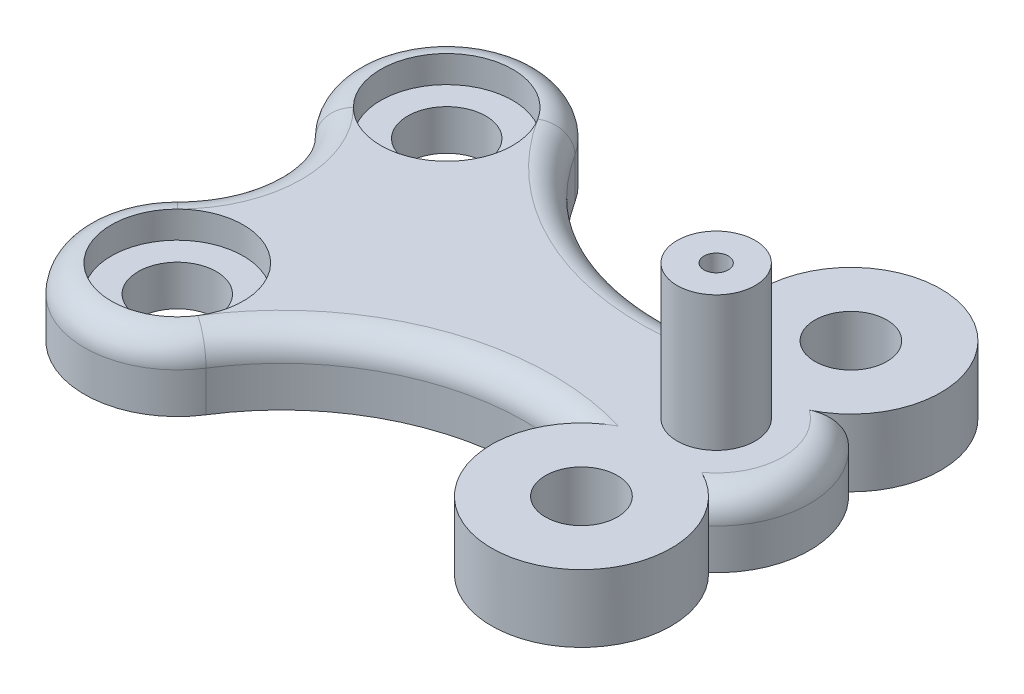
ISO-10303-21;
HEADER;
FILE_DESCRIPTION(('STEP AP214'),'2;1');
FILE_NAME('part.step','',(''),(''),'','','');
FILE_SCHEMA(('AUTOMOTIVE_DESIGN { 1 0 10303 214 1 1 1 1 }'));
ENDSEC;
DATA;
#1=APPLICATION_CONTEXT('core data for automotive mechanical design processes');
#2=APPLICATION_PROTOCOL_DEFINITION('international standard','automotive_design',2000,#1);
#3=PRODUCT_CONTEXT('',#1,'mechanical');
#4=PRODUCT('Part','Part','',(#3));
#5=PRODUCT_RELATED_PRODUCT_CATEGORY('part','',(#4));
#6=PRODUCT_DEFINITION_FORMATION('','',#4);
#7=PRODUCT_DEFINITION_CONTEXT('part definition',#1,'design');
#8=PRODUCT_DEFINITION('design','',#6,#7);
#9=PRODUCT_DEFINITION_SHAPE('','',#8);
#10=(LENGTH_UNIT() NAMED_UNIT(*) SI_UNIT(.MILLI.,.METRE.));
#11=(NAMED_UNIT(*) PLANE_ANGLE_UNIT() SI_UNIT($,.RADIAN.));
#12=(NAMED_UNIT(*) SI_UNIT($,.STERADIAN.) SOLID_ANGLE_UNIT());
#13=UNCERTAINTY_MEASURE_WITH_UNIT(LENGTH_MEASURE(1.E-05),#10,'distance_accuracy_value','');
#14=(GEOMETRIC_REPRESENTATION_CONTEXT(3) GLOBAL_UNCERTAINTY_ASSIGNED_CONTEXT((#13)) GLOBAL_UNIT_ASSIGNED_CONTEXT((#10,
#11,#12)) REPRESENTATION_CONTEXT('',''));
#15=CARTESIAN_POINT('',(0.,0.,0.));
#16=DIRECTION('',(0.,0.,1.));
#17=DIRECTION('',(1.,0.,0.));
#18=AXIS2_PLACEMENT_3D('',#15,#16,#17);
#19=CARTESIAN_POINT('',(0.,2.5,-5.));
#20=DIRECTION('',(0.,-1.,0.));
#21=DIRECTION('',(0.,0.,-1.));
#22=AXIS2_PLACEMENT_3D('',#19,#20,#21);
#23=CYLINDRICAL_SURFACE('',#22,1.45);
#24=CARTESIAN_POINT('',(0.,0.,-5.));
#25=DIRECTION('',(0.,1.,0.));
#26=DIRECTION('',(0.,0.,1.));
#27=AXIS2_PLACEMENT_3D('',#24,#25,#26);
#28=CIRCLE('',#27,1.45);
#29=CARTESIAN_POINT('',(0.,0.,-3.55));
#30=VERTEX_POINT('',#29);
#31=EDGE_CURVE('E156',#30,#30,#28,.T.);
#32=ORIENTED_EDGE('',*,*,#31,.F.);
#33=EDGE_LOOP('',(#32));
#34=FACE_BOUND('',#33,.T.);
#35=CARTESIAN_POINT('',(0.,1.5,-5.));
#36=DIRECTION('',(0.,1.,0.));
#37=DIRECTION('',(0.,0.,1.));
#38=AXIS2_PLACEMENT_3D('',#35,#36,#37);
#39=CIRCLE('',#38,1.45);
#40=CARTESIAN_POINT('',(0.,1.5,-3.55));
#41=VERTEX_POINT('',#40);
#42=EDGE_CURVE('E196',#41,#41,#39,.T.);
#43=ORIENTED_EDGE('',*,*,#42,.T.);
#44=EDGE_LOOP('',(#43));
#45=FACE_BOUND('',#44,.T.);
#46=ADVANCED_FACE('F39',(#34,#45),#23,.F.);
#47=CARTESIAN_POINT('',(0.,2.5,5.));
#48=DIRECTION('',(0.,-1.,0.));
#49=DIRECTION('',(0.,0.,-1.));
#50=AXIS2_PLACEMENT_3D('',#47,#48,#49);
#51=CYLINDRICAL_SURFACE('',#50,1.45);
#52=CARTESIAN_POINT('',(0.,0.,5.));
#53=DIRECTION('',(0.,1.,0.));
#54=DIRECTION('',(0.,0.,-1.));
#55=AXIS2_PLACEMENT_3D('',#52,#53,#54);
#56=CIRCLE('',#55,1.45);
#57=CARTESIAN_POINT('',(0.,0.,3.55));
#58=VERTEX_POINT('',#57);
#59=EDGE_CURVE('E159',#58,#58,#56,.T.);
#60=ORIENTED_EDGE('',*,*,#59,.F.);
#61=EDGE_LOOP('',(#60));
#62=FACE_BOUND('',#61,.T.);
#63=CARTESIAN_POINT('',(0.,1.5,5.));
#64=DIRECTION('',(0.,1.,0.));
#65=DIRECTION('',(0.,0.,1.));
#66=AXIS2_PLACEMENT_3D('',#63,#64,#65);
#67=CIRCLE('',#66,1.45);
#68=CARTESIAN_POINT('',(0.,1.5,6.45));
#69=VERTEX_POINT('',#68);
#70=EDGE_CURVE('E193',#69,#69,#67,.T.);
#71=ORIENTED_EDGE('',*,*,#70,.T.);
#72=EDGE_LOOP('',(#71));
#73=FACE_BOUND('',#72,.T.);
#74=ADVANCED_FACE('F273',(#62,#73),#51,.F.);
#75=CARTESIAN_POINT('',(-2.5,2.5,-2.5));
#76=DIRECTION('',(0.,1.,0.));
#77=DIRECTION('',(0.,0.,1.));
#78=AXIS2_PLACEMENT_3D('',#75,#76,#77);
#79=PLANE('',#78);
#80=CARTESIAN_POINT('',(15.,2.5,0.));
#81=DIRECTION('',(0.,1.,0.));
#82=DIRECTION('',(0.,0.,1.));
#83=AXIS2_PLACEMENT_3D('',#80,#81,#82);
#84=CIRCLE('',#83,1.45);
#85=CARTESIAN_POINT('',(15.,2.5,1.45));
#86=VERTEX_POINT('',#85);
#87=EDGE_CURVE('E338',#86,#86,#84,.T.);
#88=ORIENTED_EDGE('',*,*,#87,.F.);
#89=EDGE_LOOP('',(#88));
#90=FACE_BOUND('',#89,.T.);
#91=CARTESIAN_POINT('',(15.,2.5,-5.));
#92=DIRECTION('',(0.,1.,0.));
#93=DIRECTION('',(0.,0.,-1.));
#94=AXIS2_PLACEMENT_3D('',#91,#92,#93);
#95=CIRCLE('',#94,3.33549353927951);
#96=CARTESIAN_POINT('',(16.4579375364239,2.5,-2.00001078494247));
#97=VERTEX_POINT('',#96);
#98=CARTESIAN_POINT('',(13.4336172875358,2.5,-2.05518042171192));
#99=VERTEX_POINT('',#98);
#100=EDGE_CURVE('E162',#97,#99,#95,.T.);
#101=ORIENTED_EDGE('',*,*,#100,.T.);
#102=CARTESIAN_POINT('',(10.5657096744367,2.5,-11.69712902331));
#103=DIRECTION('',(0.,1.,0.));
#104=DIRECTION('',(0.,0.,1.));
#105=AXIS2_PLACEMENT_3D('',#102,#103,#104);
#106=CIRCLE('',#105,10.0594267686152);
#107=CARTESIAN_POINT('',(2.06931853722626,2.5,-6.311648120302));
#108=VERTEX_POINT('',#107);
#109=EDGE_CURVE('E208',#99,#108,#106,.F.);
#110=ORIENTED_EDGE('',*,*,#109,.T.);
#111=CARTESIAN_POINT('',(0.,2.5,-5.));
#112=DIRECTION('',(0.,1.,0.));
#113=DIRECTION('',(0.,0.,1.));
#114=AXIS2_PLACEMENT_3D('',#111,#112,#113);
#115=CIRCLE('',#114,2.45);
#116=CARTESIAN_POINT('',(-1.73241161390704,2.5,-3.26758838609296));
#117=VERTEX_POINT('',#116);
#118=EDGE_CURVE('E350',#117,#108,#115,.T.);
#119=ORIENTED_EDGE('',*,*,#118,.F.);
#120=CARTESIAN_POINT('',(-5.,2.5,0.));
#121=DIRECTION('',(0.,1.,0.));
#122=DIRECTION('',(0.,0.,1.));
#123=AXIS2_PLACEMENT_3D('',#120,#121,#122);
#124=CIRCLE('',#123,4.62106781186548);
#125=CARTESIAN_POINT('',(-1.73241161390704,2.5,3.26758838609296));
#126=VERTEX_POINT('',#125);
#127=EDGE_CURVE('E139',#117,#126,#124,.F.);
#128=ORIENTED_EDGE('',*,*,#127,.T.);
#129=CARTESIAN_POINT('',(0.,2.5,5.));
#130=DIRECTION('',(0.,1.,0.));
#131=DIRECTION('',(0.,0.,1.));
#132=AXIS2_PLACEMENT_3D('',#129,#130,#131);
#133=CIRCLE('',#132,2.45);
#134=CARTESIAN_POINT('',(2.06931853722626,2.5,6.311648120302));
#135=VERTEX_POINT('',#134);
#136=EDGE_CURVE('E351',#135,#126,#133,.T.);
#137=ORIENTED_EDGE('',*,*,#136,.F.);
#138=CARTESIAN_POINT('',(10.5657096744367,2.5,11.69712902331));
#139=DIRECTION('',(0.,1.,0.));
#140=DIRECTION('',(0.,0.,1.));
#141=AXIS2_PLACEMENT_3D('',#138,#139,#140);
#142=CIRCLE('',#141,10.0594267686152);
#143=CARTESIAN_POINT('',(13.4336172875358,2.5,2.05518042171192));
#144=VERTEX_POINT('',#143);
#145=EDGE_CURVE('E205',#135,#144,#142,.F.);
#146=ORIENTED_EDGE('',*,*,#145,.T.);
#147=CARTESIAN_POINT('',(15.,2.5,5.));
#148=DIRECTION('',(0.,1.,0.));
#149=DIRECTION('',(0.,0.,1.));
#150=AXIS2_PLACEMENT_3D('',#147,#148,#149);
#151=CIRCLE('',#150,3.33549353927951);
#152=CARTESIAN_POINT('',(16.4579375364239,2.5,2.00001078494247));
#153=VERTEX_POINT('',#152);
#154=EDGE_CURVE('E180',#144,#153,#151,.T.);
#155=ORIENTED_EDGE('',*,*,#154,.T.);
#156=CARTESIAN_POINT('',(15.,2.5,0.));
#157=DIRECTION('',(0.,1.,0.));
#158=DIRECTION('',(0.,0.,1.));
#159=AXIS2_PLACEMENT_3D('',#156,#157,#158);
#160=CIRCLE('',#159,2.475);
#161=EDGE_CURVE('E202',#153,#97,#160,.T.);
#162=ORIENTED_EDGE('',*,*,#161,.T.);
#163=EDGE_LOOP('',(#101,#110,#119,#128,#137,#146,#155,#162));
#164=FACE_BOUND('',#163,.T.);
#165=CARTESIAN_POINT('',(15.,2.5,5.));
#166=DIRECTION('',(0.,1.,0.));
#167=DIRECTION('',(0.,0.,1.));
#168=AXIS2_PLACEMENT_3D('',#165,#166,#167);
#169=CIRCLE('',#168,1.33549353927951);
#170=CARTESIAN_POINT('',(15.,2.5,6.33549353927951));
#171=VERTEX_POINT('',#170);
#172=EDGE_CURVE('E363',#171,#171,#169,.T.);
#173=ORIENTED_EDGE('',*,*,#172,.F.);
#174=EDGE_LOOP('',(#173));
#175=FACE_BOUND('',#174,.T.);
#176=CARTESIAN_POINT('',(15.,2.5,-5.));
#177=DIRECTION('',(0.,1.,0.));
#178=DIRECTION('',(0.,0.,-1.));
#179=AXIS2_PLACEMENT_3D('',#176,#177,#178);
#180=CIRCLE('',#179,1.33549353927951);
#181=CARTESIAN_POINT('',(15.,2.5,-6.33549353927951));
#182=VERTEX_POINT('',#181);
#183=EDGE_CURVE('E357',#182,#182,#180,.T.);
#184=ORIENTED_EDGE('',*,*,#183,.F.);
#185=EDGE_LOOP('',(#184));
#186=FACE_BOUND('',#185,.T.);
#187=ADVANCED_FACE('F280',(#90,#164,#175,#186),#79,.T.);
#188=CARTESIAN_POINT('',(-2.5,0.,-2.5));
#189=DIRECTION('',(0.,1.,0.));
#190=DIRECTION('',(0.,0.,1.));
#191=AXIS2_PLACEMENT_3D('',#188,#189,#190);
#192=PLANE('',#191);
#193=CARTESIAN_POINT('',(15.,0.,0.));
#194=DIRECTION('',(0.,1.,0.));
#195=DIRECTION('',(0.,0.,1.));
#196=AXIS2_PLACEMENT_3D('',#193,#194,#195);
#197=CIRCLE('',#196,0.449999999999998);
#198=CARTESIAN_POINT('',(15.,0.,0.449999999999998));
#199=VERTEX_POINT('',#198);
#200=EDGE_CURVE('E330',#199,#199,#197,.T.);
#201=ORIENTED_EDGE('',*,*,#200,.T.);
#202=EDGE_LOOP('',(#201));
#203=FACE_BOUND('',#202,.T.);
#204=CARTESIAN_POINT('',(-5.,0.,0.));
#205=DIRECTION('',(0.,-1.,0.));
#206=DIRECTION('',(0.,0.,1.));
#207=AXIS2_PLACEMENT_3D('',#204,#205,#206);
#208=CIRCLE('',#207,3.62106781186548);
#209=CARTESIAN_POINT('',(-2.43951839509359,0.,-2.56048160490641));
#210=VERTEX_POINT('',#209);
#211=CARTESIAN_POINT('',(-2.43951839509359,0.,2.56048160490641));
#212=VERTEX_POINT('',#211);
#213=EDGE_CURVE('E147',#210,#212,#208,.T.);
#214=ORIENTED_EDGE('',*,*,#213,.F.);
#215=CARTESIAN_POINT('',(0.,0.,-5.));
#216=DIRECTION('',(0.,1.,0.));
#217=DIRECTION('',(0.,0.,1.));
#218=AXIS2_PLACEMENT_3D('',#215,#216,#217);
#219=CIRCLE('',#218,3.45);
#220=CARTESIAN_POINT('',(2.91393834833902,0.,-6.8470147000171));
#221=VERTEX_POINT('',#220);
#222=EDGE_CURVE('E178',#221,#210,#219,.T.);
#223=ORIENTED_EDGE('',*,*,#222,.F.);
#224=CARTESIAN_POINT('',(10.5657096744367,0.,-11.69712902331));
#225=DIRECTION('',(0.,-1.,0.));
#226=DIRECTION('',(0.,0.,1.));
#227=AXIS2_PLACEMENT_3D('',#224,#225,#226);
#228=CIRCLE('',#227,9.05942676861521);
#229=CARTESIAN_POINT('',(12.4600833104509,0.,-2.83797771502572));
#230=VERTEX_POINT('',#229);
#231=EDGE_CURVE('E175',#230,#221,#228,.T.);
#232=ORIENTED_EDGE('',*,*,#231,.F.);
#233=CARTESIAN_POINT('',(15.,0.,-5.));
#234=DIRECTION('',(0.,1.,0.));
#235=DIRECTION('',(0.,0.,-1.));
#236=AXIS2_PLACEMENT_3D('',#233,#234,#235);
#237=CIRCLE('',#236,3.33549353927951);
#238=CARTESIAN_POINT('',(17.3111780602178,0.,-2.59501078494247));
#239=VERTEX_POINT('',#238);
#240=EDGE_CURVE('E172',#239,#230,#237,.T.);
#241=ORIENTED_EDGE('',*,*,#240,.F.);
#242=CARTESIAN_POINT('',(15.,0.,0.));
#243=DIRECTION('',(0.,1.,0.));
#244=DIRECTION('',(0.,0.,1.));
#245=AXIS2_PLACEMENT_3D('',#242,#243,#244);
#246=CIRCLE('',#245,3.475);
#247=CARTESIAN_POINT('',(17.3111780602178,0.,2.59501078494247));
#248=VERTEX_POINT('',#247);
#249=EDGE_CURVE('E169',#248,#239,#246,.T.);
#250=ORIENTED_EDGE('',*,*,#249,.F.);
#251=CARTESIAN_POINT('',(15.,0.,5.));
#252=DIRECTION('',(0.,1.,0.));
#253=DIRECTION('',(0.,0.,1.));
#254=AXIS2_PLACEMENT_3D('',#251,#252,#253);
#255=CIRCLE('',#254,3.33549353927951);
#256=CARTESIAN_POINT('',(12.4600833104509,0.,2.83797771502572));
#257=VERTEX_POINT('',#256);
#258=EDGE_CURVE('E166',#257,#248,#255,.T.);
#259=ORIENTED_EDGE('',*,*,#258,.F.);
#260=CARTESIAN_POINT('',(10.5657096744367,0.,11.69712902331));
#261=DIRECTION('',(0.,-1.,0.));
#262=DIRECTION('',(0.,0.,-1.));
#263=AXIS2_PLACEMENT_3D('',#260,#261,#262);
#264=CIRCLE('',#263,9.05942676861521);
#265=CARTESIAN_POINT('',(2.91393834833902,0.,6.8470147000171));
#266=VERTEX_POINT('',#265);
#267=EDGE_CURVE('E150',#266,#257,#264,.T.);
#268=ORIENTED_EDGE('',*,*,#267,.F.);
#269=CARTESIAN_POINT('',(0.,0.,5.));
#270=DIRECTION('',(0.,1.,0.));
#271=DIRECTION('',(0.,0.,-1.));
#272=AXIS2_PLACEMENT_3D('',#269,#270,#271);
#273=CIRCLE('',#272,3.45);
#274=EDGE_CURVE('E134',#212,#266,#273,.T.);
#275=ORIENTED_EDGE('',*,*,#274,.F.);
#276=EDGE_LOOP('',(#214,#223,#232,#241,#250,#259,#268,#275));
#277=FACE_BOUND('',#276,.T.);
#278=ORIENTED_EDGE('',*,*,#31,.T.);
#279=EDGE_LOOP('',(#278));
#280=FACE_BOUND('',#279,.T.);
#281=ORIENTED_EDGE('',*,*,#59,.T.);
#282=EDGE_LOOP('',(#281));
#283=FACE_BOUND('',#282,.T.);
#284=CARTESIAN_POINT('',(15.,0.,5.));
#285=DIRECTION('',(0.,1.,0.));
#286=DIRECTION('',(0.,0.,1.));
#287=AXIS2_PLACEMENT_3D('',#284,#285,#286);
#288=CIRCLE('',#287,1.33549353927951);
#289=CARTESIAN_POINT('',(15.,0.,6.33549353927951));
#290=VERTEX_POINT('',#289);
#291=EDGE_CURVE('E360',#290,#290,#288,.T.);
#292=ORIENTED_EDGE('',*,*,#291,.T.);
#293=EDGE_LOOP('',(#292));
#294=FACE_BOUND('',#293,.T.);
#295=CARTESIAN_POINT('',(15.,0.,-5.));
#296=DIRECTION('',(0.,1.,0.));
#297=DIRECTION('',(0.,0.,-1.));
#298=AXIS2_PLACEMENT_3D('',#295,#296,#297);
#299=CIRCLE('',#298,1.33549353927951);
#300=CARTESIAN_POINT('',(15.,0.,-6.33549353927951));
#301=VERTEX_POINT('',#300);
#302=EDGE_CURVE('E200',#301,#301,#299,.T.);
#303=ORIENTED_EDGE('',*,*,#302,.T.);
#304=EDGE_LOOP('',(#303));
#305=FACE_BOUND('',#304,.T.);
#306=ADVANCED_FACE('F144',(#203,#277,#280,#283,#294,#305),#192,.F.);
#307=CARTESIAN_POINT('',(-5.,2.5,0.));
#308=DIRECTION('',(0.,-1.,0.));
#309=DIRECTION('',(0.,0.,-1.));
#310=AXIS2_PLACEMENT_3D('',#307,#308,#309);
#311=CYLINDRICAL_SURFACE('',#310,3.62106781186548);
#312=DIRECTION('',(0.,-1.,0.));
#313=VECTOR('',#312,1.);
#314=CARTESIAN_POINT('',(-2.43951839509359,2.5,2.56048160490641));
#315=LINE('',#314,#313);
#316=CARTESIAN_POINT('',(-2.43951839509359,1.5,2.56048160490641));
#317=VERTEX_POINT('',#316);
#318=EDGE_CURVE('E131',#317,#212,#315,.T.);
#319=ORIENTED_EDGE('',*,*,#318,.F.);
#320=CARTESIAN_POINT('',(-5.,1.5,0.));
#321=DIRECTION('',(0.,1.,0.));
#322=DIRECTION('',(0.,0.,1.));
#323=AXIS2_PLACEMENT_3D('',#320,#321,#322);
#324=CIRCLE('',#323,3.62106781186548);
#325=CARTESIAN_POINT('',(-2.43951839509359,1.5,-2.56048160490641));
#326=VERTEX_POINT('',#325);
#327=EDGE_CURVE('E219',#317,#326,#324,.T.);
#328=ORIENTED_EDGE('',*,*,#327,.T.);
#329=DIRECTION('',(0.,-1.,0.));
#330=VECTOR('',#329,1.);
#331=CARTESIAN_POINT('',(-2.43951839509359,2.5,-2.56048160490641));
#332=LINE('',#331,#330);
#333=EDGE_CURVE('E154',#326,#210,#332,.T.);
#334=ORIENTED_EDGE('',*,*,#333,.T.);
#335=ORIENTED_EDGE('',*,*,#213,.T.);
#336=EDGE_LOOP('',(#319,#328,#334,#335));
#337=FACE_BOUND('',#336,.T.);
#338=ADVANCED_FACE('F152',(#337),#311,.F.);
#339=CARTESIAN_POINT('',(0.,2.5,5.));
#340=DIRECTION('',(0.,-1.,0.));
#341=DIRECTION('',(0.,0.,-1.));
#342=AXIS2_PLACEMENT_3D('',#339,#340,#341);
#343=CYLINDRICAL_SURFACE('',#342,3.45);
#344=DIRECTION('',(0.,-1.,0.));
#345=VECTOR('',#344,1.);
#346=CARTESIAN_POINT('',(2.91393834833902,2.5,6.8470147000171));
#347=LINE('',#346,#345);
#348=CARTESIAN_POINT('',(2.91393834833902,1.5,6.8470147000171));
#349=VERTEX_POINT('',#348);
#350=EDGE_CURVE('E140',#349,#266,#347,.T.);
#351=ORIENTED_EDGE('',*,*,#350,.F.);
#352=CARTESIAN_POINT('',(0.,1.5,5.));
#353=DIRECTION('',(0.,1.,0.));
#354=DIRECTION('',(0.,0.,1.));
#355=AXIS2_PLACEMENT_3D('',#352,#353,#354);
#356=CIRCLE('',#355,3.45);
#357=EDGE_CURVE('E57',#349,#317,#356,.F.);
#358=ORIENTED_EDGE('',*,*,#357,.T.);
#359=ORIENTED_EDGE('',*,*,#318,.T.);
#360=ORIENTED_EDGE('',*,*,#274,.T.);
#361=EDGE_LOOP('',(#351,#358,#359,#360));
#362=FACE_BOUND('',#361,.T.);
#363=ADVANCED_FACE('F133',(#362),#343,.T.);
#364=CARTESIAN_POINT('',(10.5657096744367,2.5,11.69712902331));
#365=DIRECTION('',(0.,-1.,0.));
#366=DIRECTION('',(0.,0.,-1.));
#367=AXIS2_PLACEMENT_3D('',#364,#365,#366);
#368=CYLINDRICAL_SURFACE('',#367,9.05942676861521);
#369=DIRECTION('',(0.,-1.,0.));
#370=VECTOR('',#369,1.);
#371=CARTESIAN_POINT('',(12.4600833104509,2.5,2.83797771502572));
#372=LINE('',#371,#370);
#373=CARTESIAN_POINT('',(12.4600833104509,1.5,2.83797771502572));
#374=VERTEX_POINT('',#373);
#375=EDGE_CURVE('E190',#374,#257,#372,.T.);
#376=ORIENTED_EDGE('',*,*,#375,.F.);
#377=CARTESIAN_POINT('',(10.5657096744367,1.5,11.69712902331));
#378=DIRECTION('',(0.,1.,0.));
#379=DIRECTION('',(0.,0.,1.));
#380=AXIS2_PLACEMENT_3D('',#377,#378,#379);
#381=CIRCLE('',#380,9.05942676861521);
#382=EDGE_CURVE('E215',#374,#349,#381,.T.);
#383=ORIENTED_EDGE('',*,*,#382,.T.);
#384=ORIENTED_EDGE('',*,*,#350,.T.);
#385=ORIENTED_EDGE('',*,*,#267,.T.);
#386=EDGE_LOOP('',(#376,#383,#384,#385));
#387=FACE_BOUND('',#386,.T.);
#388=ADVANCED_FACE('F526',(#387),#368,.F.);
#389=CARTESIAN_POINT('',(15.,2.5,5.));
#390=DIRECTION('',(0.,-1.,0.));
#391=DIRECTION('',(0.,0.,-1.));
#392=AXIS2_PLACEMENT_3D('',#389,#390,#391);
#393=CYLINDRICAL_SURFACE('',#392,3.33549353927951);
#394=ORIENTED_EDGE('',*,*,#258,.T.);
#395=DIRECTION('',(0.,-1.,0.));
#396=VECTOR('',#395,1.);
#397=CARTESIAN_POINT('',(17.3111780602178,2.5,2.59501078494247));
#398=LINE('',#397,#396);
#399=CARTESIAN_POINT('',(17.3111780602178,1.5,2.59501078494247));
#400=VERTEX_POINT('',#399);
#401=EDGE_CURVE('E188',#400,#248,#398,.T.);
#402=ORIENTED_EDGE('',*,*,#401,.F.);
#403=CARTESIAN_POINT('',(17.3111780602178,1.5,2.59501078494247));
#404=CARTESIAN_POINT('',(17.311176426978,1.52796667590695,2.59501200572259));
#405=CARTESIAN_POINT('',(17.3103292196507,1.55592002410739,2.59419473837147));
#406=CARTESIAN_POINT('',(17.3069395838472,1.61162836455529,2.5909431244576));
#407=CARTESIAN_POINT('',(17.3043972018912,1.6393833622249,2.58850882227079));
#408=CARTESIAN_POINT('',(17.2942304976369,1.72201934108391,2.57881908139407));
#409=CARTESIAN_POINT('',(17.284066628593,1.77634960515996,2.56917669571698));
#410=CARTESIAN_POINT('',(17.2569990863216,1.88189206954837,2.54402570561686));
#411=CARTESIAN_POINT('',(17.2400913196402,1.93310235427315,2.52851353861054));
#412=CARTESIAN_POINT('',(17.1996392384792,2.03092061329871,2.49244426689159));
#413=CARTESIAN_POINT('',(17.1760960570154,2.07752937149007,2.4718880235467));
#414=CARTESIAN_POINT('',(17.1227752089272,2.16450951970483,2.42695774057362));
#415=CARTESIAN_POINT('',(17.093037152424,2.20491783426267,2.40260819348588));
#416=CARTESIAN_POINT('',(17.0276895586364,2.27867357768844,2.35128086795699));
#417=CARTESIAN_POINT('',(16.9920825897963,2.31202408078739,2.32430424132295));
#418=CARTESIAN_POINT('',(16.9162234991073,2.37041309405086,2.26947594982183));
#419=CARTESIAN_POINT('',(16.8760416086199,2.3955591000786,2.24164131029133));
#420=CARTESIAN_POINT('',(16.7915401343231,2.43774139882766,2.1860241017074));
#421=CARTESIAN_POINT('',(16.7472170097563,2.45477067443056,2.15824159831759));
#422=CARTESIAN_POINT('',(16.662474449849,2.4787618603051,2.1079866943643));
#423=CARTESIAN_POINT('',(16.6224656368852,2.4868501383302,2.08534253244162));
#424=CARTESIAN_POINT('',(16.5410825389584,2.49747750701947,2.04149551173209));
#425=CARTESIAN_POINT('',(16.499712247469,2.50003157385176,2.02028891396824));
#426=CARTESIAN_POINT('',(16.4579375364239,2.5,2.00001078494247));
#427=B_SPLINE_CURVE_WITH_KNOTS('',3,(#403,#404,#405,#406,#407,#408,#409,#410,#411,#412,#413,
#414,#415,#416,#417,#418,#419,#420,#421,#422,#423,#424,#425,#426),.UNSPECIFIED.,.F.,.F.,(4,2,2,
2,2,2,2,2,2,2,2,4),(0.,0.0838487492166892,0.167695197485527,0.335156177103973,0.502718958317027,
0.670253145028116,0.836747302598351,1.0031687889405,1.16731297501027,1.3315988116313,
1.47126092659753,1.61054462644997),.UNSPECIFIED.);
#428=EDGE_CURVE('E11',#400,#153,#427,.T.);
#429=ORIENTED_EDGE('',*,*,#428,.T.);
#430=ORIENTED_EDGE('',*,*,#154,.F.);
#431=CARTESIAN_POINT('',(13.4336172875358,2.5,2.05518042171192));
#432=CARTESIAN_POINT('',(13.3963474625449,2.49999702773719,2.07499754745905));
#433=CARTESIAN_POINT('',(13.3594443603618,2.49868300782681,2.09554130400971));
#434=CARTESIAN_POINT('',(13.2865423302807,2.49317260774014,2.13794646662976));
#435=CARTESIAN_POINT('',(13.2505450516333,2.48897131596692,2.15981006000065));
#436=CARTESIAN_POINT('',(13.1795142218056,2.47738523501374,2.20480247263762));
#437=CARTESIAN_POINT('',(13.1444888554607,2.46997906340666,2.22793886244882));
#438=CARTESIAN_POINT('',(13.0759722994242,2.45172381370213,2.27504788323897));
#439=CARTESIAN_POINT('',(13.0424799930265,2.44087728879804,2.29901988238042));
#440=CARTESIAN_POINT('',(12.9606155647217,2.40897700307576,2.35988998765101));
#441=CARTESIAN_POINT('',(12.9133879919567,2.38553971782977,2.3971321926572));
#442=CARTESIAN_POINT('',(12.8243652567407,2.32960524736891,2.47107267921718));
#443=CARTESIAN_POINT('',(12.7825555372053,2.29713310991904,2.50777217328414));
#444=CARTESIAN_POINT('',(12.7050635782295,2.22259445914801,2.57893080963577));
#445=CARTESIAN_POINT('',(12.6694382038282,2.18044641732669,2.61336751864076));
#446=CARTESIAN_POINT('',(12.6058825918849,2.0872958850814,2.67712348165083));
#447=CARTESIAN_POINT('',(12.5779521510239,2.03629362866555,2.70644287086056));
#448=CARTESIAN_POINT('',(12.5337827120907,1.93431342766898,2.75406905526375));
#449=CARTESIAN_POINT('',(12.5164832954759,1.88423289945991,2.77332153140347));
#450=CARTESIAN_POINT('',(12.4886455934779,1.78016209452912,2.80476359307777));
#451=CARTESIAN_POINT('',(12.4780963921923,1.72617828805397,2.8169645786036));
#452=CARTESIAN_POINT('',(12.4673623566669,1.64301850086813,2.82944895022519));
#453=CARTESIAN_POINT('',(12.4646320369796,1.61455899830182,2.83264250466884));
#454=CARTESIAN_POINT('',(12.4609945586349,1.55740537003657,2.83690680669164));
#455=CARTESIAN_POINT('',(12.4600848998113,1.52871162048907,2.83798046532472));
#456=CARTESIAN_POINT('',(12.4600833104509,1.5,2.83797771502572));
#457=B_SPLINE_CURVE_WITH_KNOTS('',3,(#431,#432,#433,#434,#435,#436,#437,#438,#439,#440,#441,
#442,#443,#444,#445,#446,#447,#448,#449,#450,#451,#452,#453,#454,#455,#456),.UNSPECIFIED.,.F.,
.F.,(4,2,2,2,2,2,2,2,2,2,2,2,4),(0.,0.126630117964689,0.253476183954439,0.381181919041617,
0.508793100603784,0.701630675525511,0.893938874807162,1.08793113143837,1.28191826182666,
1.45012701640006,1.61806306531606,1.70424690028498,1.79031230454504),.UNSPECIFIED.);
#458=EDGE_CURVE('E230',#144,#374,#457,.T.);
#459=ORIENTED_EDGE('',*,*,#458,.T.);
#460=ORIENTED_EDGE('',*,*,#375,.T.);
#461=EDGE_LOOP('',(#394,#402,#429,#430,#459,#460));
#462=FACE_BOUND('',#461,.T.);
#463=ADVANCED_FACE('F521',(#462),#393,.T.);
#464=CARTESIAN_POINT('',(15.,2.5,0.));
#465=DIRECTION('',(0.,-1.,0.));
#466=DIRECTION('',(0.,0.,-1.));
#467=AXIS2_PLACEMENT_3D('',#464,#465,#466);
#468=CYLINDRICAL_SURFACE('',#467,3.475);
#469=DIRECTION('',(0.,-1.,0.));
#470=VECTOR('',#469,1.);
#471=CARTESIAN_POINT('',(17.3111780602178,2.5,-2.59501078494247));
#472=LINE('',#471,#470);
#473=CARTESIAN_POINT('',(17.3111780602178,1.5,-2.59501078494247));
#474=VERTEX_POINT('',#473);
#475=EDGE_CURVE('E186',#474,#239,#472,.T.);
#476=ORIENTED_EDGE('',*,*,#475,.F.);
#477=CARTESIAN_POINT('',(15.,1.5,0.));
#478=DIRECTION('',(0.,1.,0.));
#479=DIRECTION('',(0.,0.,1.));
#480=AXIS2_PLACEMENT_3D('',#477,#478,#479);
#481=CIRCLE('',#480,3.475);
#482=EDGE_CURVE('E65',#474,#400,#481,.F.);
#483=ORIENTED_EDGE('',*,*,#482,.T.);
#484=ORIENTED_EDGE('',*,*,#401,.T.);
#485=ORIENTED_EDGE('',*,*,#249,.T.);
#486=EDGE_LOOP('',(#476,#483,#484,#485));
#487=FACE_BOUND('',#486,.T.);
#488=ADVANCED_FACE('F303',(#487),#468,.T.);
#489=CARTESIAN_POINT('',(15.,2.5,-5.));
#490=DIRECTION('',(0.,-1.,0.));
#491=DIRECTION('',(0.,0.,-1.));
#492=AXIS2_PLACEMENT_3D('',#489,#490,#491);
#493=CYLINDRICAL_SURFACE('',#492,3.33549353927951);
#494=ORIENTED_EDGE('',*,*,#240,.T.);
#495=DIRECTION('',(0.,-1.,0.));
#496=VECTOR('',#495,1.);
#497=CARTESIAN_POINT('',(12.4600833104509,2.5,-2.83797771502572));
#498=LINE('',#497,#496);
#499=CARTESIAN_POINT('',(12.4600833104509,1.5,-2.83797771502572));
#500=VERTEX_POINT('',#499);
#501=EDGE_CURVE('E184',#500,#230,#498,.T.);
#502=ORIENTED_EDGE('',*,*,#501,.F.);
#503=CARTESIAN_POINT('',(12.4600833104509,1.5,-2.83797771502572));
#504=CARTESIAN_POINT('',(12.4600842670412,1.52531007983279,-2.83797928671575));
#505=CARTESIAN_POINT('',(12.460791302299,1.55060753638414,-2.83714569006275));
#506=CARTESIAN_POINT('',(12.4636170017959,1.60101071131777,-2.83383160951549));
#507=CARTESIAN_POINT('',(12.4657354232331,1.62611646192812,-2.83135140888808));
#508=CARTESIAN_POINT('',(12.4741864221253,1.70072493067497,-2.82150001051224));
#509=CARTESIAN_POINT('',(12.482614785978,1.74970869704039,-2.81171763826603));
#510=CARTESIAN_POINT('',(12.5049551795033,1.84477367101202,-2.78628125404725));
#511=CARTESIAN_POINT('',(12.5188667534003,1.89085511949568,-2.77062773010206));
#512=CARTESIAN_POINT('',(12.5519697497081,1.97899018132105,-2.73432879721393));
#513=CARTESIAN_POINT('',(12.5711631596833,2.02104227036064,-2.71368150946381));
#514=CARTESIAN_POINT('',(12.6150713342727,2.10124807983884,-2.66790634541417));
#515=CARTESIAN_POINT('',(12.6399187354056,2.13926923546124,-2.64267438405938));
#516=CARTESIAN_POINT('',(12.6943259435414,2.20949438102386,-2.5894334309314));
#517=CARTESIAN_POINT('',(12.7238846043143,2.24169978185816,-2.56142511525869));
#518=CARTESIAN_POINT('',(12.7901031288439,2.30282405959316,-2.50118914724847));
#519=CARTESIAN_POINT('',(12.8271686784401,2.33115331323294,-2.46881192873515));
#520=CARTESIAN_POINT('',(12.9055306205965,2.38080358052467,-2.40359474236044));
#521=CARTESIAN_POINT('',(12.9468383431353,2.40210515091474,-2.37075374852632));
#522=CARTESIAN_POINT('',(13.0236546157931,2.43422188482315,-2.31273716493182));
#523=CARTESIAN_POINT('',(13.0585355700982,2.44630284912424,-2.28741277485569));
#524=CARTESIAN_POINT('',(13.1300457014262,2.46662492813387,-2.23763006734593));
#525=CARTESIAN_POINT('',(13.1666766794065,2.47486198895818,-2.21317268928335));
#526=CARTESIAN_POINT('',(13.2411291895484,2.48775188221044,-2.16559879735809));
#527=CARTESIAN_POINT('',(13.2789437911065,2.49242256929747,-2.14247614698937));
#528=CARTESIAN_POINT('',(13.3555781323272,2.49854148503531,-2.0976952212356));
#529=CARTESIAN_POINT('',(13.394395517113,2.49999667254493,-2.07603388210079));
#530=CARTESIAN_POINT('',(13.4336172875358,2.5,-2.05518042171192));
#531=B_SPLINE_CURVE_WITH_KNOTS('',3,(#503,#504,#505,#506,#507,#508,#509,#510,#511,#512,#513,
#514,#515,#516,#517,#518,#519,#520,#521,#522,#523,#524,#525,#526,#527,#528,#529,#530),
.UNSPECIFIED.,.F.,.F.,(4,2,2,2,2,2,2,2,2,2,2,2,2,4),(0.,0.0758817930300245,0.151750535423868,
0.302926059079315,0.454089019364944,0.605308940506206,0.760529448978575,0.915712250432526,
1.08541773632338,1.25558887855624,1.38967667901755,1.52390557427129,1.65745797956645,
1.79072107170585),.UNSPECIFIED.);
#532=EDGE_CURVE('E221',#500,#99,#531,.T.);
#533=ORIENTED_EDGE('',*,*,#532,.T.);
#534=ORIENTED_EDGE('',*,*,#100,.F.);
#535=CARTESIAN_POINT('',(16.4579375364239,2.5,-2.00001078494247));
#536=CARTESIAN_POINT('',(16.4846271040725,2.5000009786253,-2.01297970493529));
#537=CARTESIAN_POINT('',(16.5111370053766,2.4989688102167,-2.02630563452589));
#538=CARTESIAN_POINT('',(16.5636714811412,2.49471555252124,-2.05359120985321));
#539=CARTESIAN_POINT('',(16.5896957129151,2.49149297354183,-2.06755128083442));
#540=CARTESIAN_POINT('',(16.6668489449815,2.47834845224571,-2.11026388924502));
#541=CARTESIAN_POINT('',(16.7170032115343,2.46494921864743,-2.13982188754397));
#542=CARTESIAN_POINT('',(16.8133354899127,2.42842009124517,-2.19989743295295));
#543=CARTESIAN_POINT('',(16.8594960278399,2.40524980808576,-2.23041847077267));
#544=CARTESIAN_POINT('',(16.9462182799809,2.34949587722914,-2.29065761926639));
#545=CARTESIAN_POINT('',(16.9867891750999,2.31692794406526,-2.32037698050671));
#546=CARTESIAN_POINT('',(17.0587322682229,2.24589854678548,-2.37530074357251));
#547=CARTESIAN_POINT('',(17.0905536568053,2.20802154191181,-2.40067594294977));
#548=CARTESIAN_POINT('',(17.1480620439537,2.12594614806885,-2.44799359312813));
#549=CARTESIAN_POINT('',(17.1737456529509,2.08174428765993,-2.46993414485992));
#550=CARTESIAN_POINT('',(17.2184705081662,1.98869937896506,-2.50905940286613));
#551=CARTESIAN_POINT('',(17.2375643720238,1.93989725468295,-2.52628154503717));
#552=CARTESIAN_POINT('',(17.2692579637117,1.83872631755998,-2.55532226979519));
#553=CARTESIAN_POINT('',(17.2818612999009,1.7863595048546,-2.56714385436692));
#554=CARTESIAN_POINT('',(17.2978590463427,1.69482200397259,-2.58226417559892));
#555=CARTESIAN_POINT('',(17.3028561251381,1.65615909798353,-2.58703332835422));
#556=CARTESIAN_POINT('',(17.3095128548417,1.57833557780007,-2.59341056834821));
#557=CARTESIAN_POINT('',(17.3111764427106,1.53917560575466,-2.59502238445314));
#558=CARTESIAN_POINT('',(17.3111780602178,1.5,-2.59501078494247));
#559=B_SPLINE_CURVE_WITH_KNOTS('',3,(#535,#536,#537,#538,#539,#540,#541,#542,#543,#544,#545,
#546,#547,#548,#549,#550,#551,#552,#553,#554,#555,#556,#557,#558),.UNSPECIFIED.,.F.,.F.,(4,2,2,
2,2,2,2,2,2,2,2,4),(0.,0.0889839780895157,0.178028534584331,0.356299947107043,0.535315594702198,
0.714033614177607,0.880031346111446,1.0461205390017,1.21085107788142,1.37548993695357,
1.49305703982188,1.61048521010437),.UNSPECIFIED.);
#560=EDGE_CURVE('E49',#97,#474,#559,.T.);
#561=ORIENTED_EDGE('',*,*,#560,.T.);
#562=ORIENTED_EDGE('',*,*,#475,.T.);
#563=EDGE_LOOP('',(#494,#502,#533,#534,#561,#562));
#564=FACE_BOUND('',#563,.T.);
#565=ADVANCED_FACE('F237',(#564),#493,.T.);
#566=CARTESIAN_POINT('',(10.5657096744367,2.5,-11.69712902331));
#567=DIRECTION('',(0.,-1.,0.));
#568=DIRECTION('',(0.,0.,-1.));
#569=AXIS2_PLACEMENT_3D('',#566,#567,#568);
#570=CYLINDRICAL_SURFACE('',#569,9.05942676861521);
#571=DIRECTION('',(0.,-1.,0.));
#572=VECTOR('',#571,1.);
#573=CARTESIAN_POINT('',(2.91393834833902,2.5,-6.8470147000171));
#574=LINE('',#573,#572);
#575=CARTESIAN_POINT('',(2.91393834833902,1.5,-6.8470147000171));
#576=VERTEX_POINT('',#575);
#577=EDGE_CURVE('E182',#576,#221,#574,.T.);
#578=ORIENTED_EDGE('',*,*,#577,.F.);
#579=CARTESIAN_POINT('',(10.5657096744367,1.5,-11.69712902331));
#580=DIRECTION('',(0.,1.,0.));
#581=DIRECTION('',(0.,0.,1.));
#582=AXIS2_PLACEMENT_3D('',#579,#580,#581);
#583=CIRCLE('',#582,9.05942676861521);
#584=EDGE_CURVE('E211',#576,#500,#583,.T.);
#585=ORIENTED_EDGE('',*,*,#584,.T.);
#586=ORIENTED_EDGE('',*,*,#501,.T.);
#587=ORIENTED_EDGE('',*,*,#231,.T.);
#588=EDGE_LOOP('',(#578,#585,#586,#587));
#589=FACE_BOUND('',#588,.T.);
#590=ADVANCED_FACE('F296',(#589),#570,.F.);
#591=CARTESIAN_POINT('',(0.,2.5,-5.));
#592=DIRECTION('',(0.,-1.,0.));
#593=DIRECTION('',(0.,0.,-1.));
#594=AXIS2_PLACEMENT_3D('',#591,#592,#593);
#595=CYLINDRICAL_SURFACE('',#594,3.45);
#596=ORIENTED_EDGE('',*,*,#333,.F.);
#597=CARTESIAN_POINT('',(0.,1.5,-5.));
#598=DIRECTION('',(0.,1.,0.));
#599=DIRECTION('',(0.,0.,1.));
#600=AXIS2_PLACEMENT_3D('',#597,#598,#599);
#601=CIRCLE('',#600,3.45);
#602=EDGE_CURVE('E213',#326,#576,#601,.F.);
#603=ORIENTED_EDGE('',*,*,#602,.T.);
#604=ORIENTED_EDGE('',*,*,#577,.T.);
#605=ORIENTED_EDGE('',*,*,#222,.T.);
#606=EDGE_LOOP('',(#596,#603,#604,#605));
#607=FACE_BOUND('',#606,.T.);
#608=ADVANCED_FACE('F293',(#607),#595,.T.);
#609=CARTESIAN_POINT('',(15.,2.5,5.));
#610=DIRECTION('',(0.,-1.,0.));
#611=DIRECTION('',(0.,0.,-1.));
#612=AXIS2_PLACEMENT_3D('',#609,#610,#611);
#613=CYLINDRICAL_SURFACE('',#612,1.33549353927951);
#614=ORIENTED_EDGE('',*,*,#172,.T.);
#615=EDGE_LOOP('',(#614));
#616=FACE_BOUND('',#615,.T.);
#617=ORIENTED_EDGE('',*,*,#291,.F.);
#618=EDGE_LOOP('',(#617));
#619=FACE_BOUND('',#618,.T.);
#620=ADVANCED_FACE('F295',(#616,#619),#613,.F.);
#621=CARTESIAN_POINT('',(15.,2.5,-5.));
#622=DIRECTION('',(0.,-1.,0.));
#623=DIRECTION('',(0.,0.,-1.));
#624=AXIS2_PLACEMENT_3D('',#621,#622,#623);
#625=CYLINDRICAL_SURFACE('',#624,1.33549353927951);
#626=ORIENTED_EDGE('',*,*,#183,.T.);
#627=EDGE_LOOP('',(#626));
#628=FACE_BOUND('',#627,.T.);
#629=ORIENTED_EDGE('',*,*,#302,.F.);
#630=EDGE_LOOP('',(#629));
#631=FACE_BOUND('',#630,.T.);
#632=ADVANCED_FACE('F383',(#628,#631),#625,.F.);
#633=CARTESIAN_POINT('',(0.,1.5,5.));
#634=DIRECTION('',(0.,1.,0.));
#635=DIRECTION('',(0.,0.,1.));
#636=AXIS2_PLACEMENT_3D('',#633,#634,#635);
#637=CYLINDRICAL_SURFACE('',#636,2.45);
#638=CARTESIAN_POINT('',(0.,1.5,5.));
#639=DIRECTION('',(0.,1.,0.));
#640=DIRECTION('',(0.,0.,1.));
#641=AXIS2_PLACEMENT_3D('',#638,#639,#640);
#642=CIRCLE('',#641,2.45);
#643=CARTESIAN_POINT('',(0.,1.5,7.45));
#644=VERTEX_POINT('',#643);
#645=EDGE_CURVE('E344',#644,#644,#642,.T.);
#646=ORIENTED_EDGE('',*,*,#645,.F.);
#647=EDGE_LOOP('',(#646));
#648=FACE_BOUND('',#647,.T.);
#649=ORIENTED_EDGE('',*,*,#136,.T.);
#650=EDGE_CURVE('E354',#126,#135,#133,.T.);
#651=ORIENTED_EDGE('',*,*,#650,.T.);
#652=EDGE_LOOP('',(#649,#651));
#653=FACE_BOUND('',#652,.T.);
#654=ADVANCED_FACE('F380',(#648,#653),#637,.F.);
#655=CARTESIAN_POINT('',(0.,1.5,5.));
#656=DIRECTION('',(0.,1.,0.));
#657=DIRECTION('',(0.,0.,1.));
#658=AXIS2_PLACEMENT_3D('',#655,#656,#657);
#659=PLANE('',#658);
#660=ORIENTED_EDGE('',*,*,#70,.F.);
#661=EDGE_LOOP('',(#660));
#662=FACE_BOUND('',#661,.T.);
#663=ORIENTED_EDGE('',*,*,#645,.T.);
#664=EDGE_LOOP('',(#663));
#665=FACE_BOUND('',#664,.T.);
#666=ADVANCED_FACE('F382',(#662,#665),#659,.T.);
#667=CARTESIAN_POINT('',(0.,1.5,-5.));
#668=DIRECTION('',(0.,1.,0.));
#669=DIRECTION('',(0.,0.,1.));
#670=AXIS2_PLACEMENT_3D('',#667,#668,#669);
#671=CYLINDRICAL_SURFACE('',#670,2.45);
#672=CARTESIAN_POINT('',(0.,1.5,-5.));
#673=DIRECTION('',(0.,1.,0.));
#674=DIRECTION('',(0.,0.,1.));
#675=AXIS2_PLACEMENT_3D('',#672,#673,#674);
#676=CIRCLE('',#675,2.45);
#677=CARTESIAN_POINT('',(0.,1.5,-2.55));
#678=VERTEX_POINT('',#677);
#679=EDGE_CURVE('E197',#678,#678,#676,.T.);
#680=ORIENTED_EDGE('',*,*,#679,.F.);
#681=EDGE_LOOP('',(#680));
#682=FACE_BOUND('',#681,.T.);
#683=EDGE_CURVE('E317',#108,#117,#115,.T.);
#684=ORIENTED_EDGE('',*,*,#683,.T.);
#685=ORIENTED_EDGE('',*,*,#118,.T.);
#686=EDGE_LOOP('',(#684,#685));
#687=FACE_BOUND('',#686,.T.);
#688=ADVANCED_FACE('F389',(#682,#687),#671,.F.);
#689=CARTESIAN_POINT('',(0.,1.5,-5.));
#690=DIRECTION('',(0.,1.,0.));
#691=DIRECTION('',(0.,0.,1.));
#692=AXIS2_PLACEMENT_3D('',#689,#690,#691);
#693=PLANE('',#692);
#694=ORIENTED_EDGE('',*,*,#42,.F.);
#695=EDGE_LOOP('',(#694));
#696=FACE_BOUND('',#695,.T.);
#697=ORIENTED_EDGE('',*,*,#679,.T.);
#698=EDGE_LOOP('',(#697));
#699=FACE_BOUND('',#698,.T.);
#700=ADVANCED_FACE('F445',(#696,#699),#693,.T.);
#701=CARTESIAN_POINT('',(15.,7.5,0.));
#702=DIRECTION('',(0.,1.,0.));
#703=DIRECTION('',(0.,0.,1.));
#704=AXIS2_PLACEMENT_3D('',#701,#702,#703);
#705=PLANE('',#704);
#706=CARTESIAN_POINT('',(15.,7.5,0.));
#707=DIRECTION('',(0.,1.,0.));
#708=DIRECTION('',(0.,0.,1.));
#709=AXIS2_PLACEMENT_3D('',#706,#707,#708);
#710=CIRCLE('',#709,1.45);
#711=CARTESIAN_POINT('',(15.,7.5,1.45));
#712=VERTEX_POINT('',#711);
#713=EDGE_CURVE('E341',#712,#712,#710,.T.);
#714=ORIENTED_EDGE('',*,*,#713,.T.);
#715=EDGE_LOOP('',(#714));
#716=FACE_BOUND('',#715,.T.);
#717=CARTESIAN_POINT('',(15.,7.5,0.));
#718=DIRECTION('',(0.,1.,0.));
#719=DIRECTION('',(0.,0.,1.));
#720=AXIS2_PLACEMENT_3D('',#717,#718,#719);
#721=CIRCLE('',#720,0.449999999999998);
#722=CARTESIAN_POINT('',(15.,7.5,0.449999999999998));
#723=VERTEX_POINT('',#722);
#724=EDGE_CURVE('E334',#723,#723,#721,.T.);
#725=ORIENTED_EDGE('',*,*,#724,.F.);
#726=EDGE_LOOP('',(#725));
#727=FACE_BOUND('',#726,.T.);
#728=ADVANCED_FACE('F453',(#716,#727),#705,.T.);
#729=CARTESIAN_POINT('',(15.,7.5,0.));
#730=DIRECTION('',(0.,-1.,0.));
#731=DIRECTION('',(0.,0.,-1.));
#732=AXIS2_PLACEMENT_3D('',#729,#730,#731);
#733=CYLINDRICAL_SURFACE('',#732,1.45);
#734=ORIENTED_EDGE('',*,*,#713,.F.);
#735=EDGE_LOOP('',(#734));
#736=FACE_BOUND('',#735,.T.);
#737=ORIENTED_EDGE('',*,*,#87,.T.);
#738=EDGE_LOOP('',(#737));
#739=FACE_BOUND('',#738,.T.);
#740=ADVANCED_FACE('F268',(#736,#739),#733,.T.);
#741=CARTESIAN_POINT('',(15.,7.5,0.));
#742=DIRECTION('',(0.,-1.,0.));
#743=DIRECTION('',(0.,0.,-1.));
#744=AXIS2_PLACEMENT_3D('',#741,#742,#743);
#745=CYLINDRICAL_SURFACE('',#744,0.449999999999998);
#746=ORIENTED_EDGE('',*,*,#724,.T.);
#747=EDGE_LOOP('',(#746));
#748=FACE_BOUND('',#747,.T.);
#749=ORIENTED_EDGE('',*,*,#200,.F.);
#750=EDGE_LOOP('',(#749));
#751=FACE_BOUND('',#750,.T.);
#752=ADVANCED_FACE('F262',(#748,#751),#745,.F.);
#753=CARTESIAN_POINT('',(10.5657096744367,1.5,11.69712902331));
#754=DIRECTION('',(0.,1.,0.));
#755=DIRECTION('',(0.,0.,1.));
#756=AXIS2_PLACEMENT_3D('',#753,#754,#755);
#757=TOROIDAL_SURFACE('',#756,10.0594267686152,1.);
#758=ORIENTED_EDGE('',*,*,#458,.F.);
#759=ORIENTED_EDGE('',*,*,#145,.F.);
#760=CARTESIAN_POINT('',(2.06931853722626,1.5,6.311648120302));
#761=DIRECTION('',(-0.5353665797151,0.,0.84461981111276));
#762=DIRECTION('',(0.844619811112761,0.,0.5353665797151));
#763=AXIS2_PLACEMENT_3D('',#760,#761,#762);
#764=CIRCLE('',#763,1.);
#765=EDGE_CURVE('E44',#349,#135,#764,.T.);
#766=ORIENTED_EDGE('',*,*,#765,.F.);
#767=ORIENTED_EDGE('',*,*,#382,.F.);
#768=EDGE_LOOP('',(#758,#759,#766,#767));
#769=FACE_BOUND('',#768,.T.);
#770=ADVANCED_FACE('F258',(#769),#757,.T.);
#771=CARTESIAN_POINT('',(0.,1.5,5.));
#772=DIRECTION('',(0.,1.,0.));
#773=DIRECTION('',(0.,0.,1.));
#774=AXIS2_PLACEMENT_3D('',#771,#772,#773);
#775=TOROIDAL_SURFACE('',#774,2.45,1.);
#776=ORIENTED_EDGE('',*,*,#765,.T.);
#777=ORIENTED_EDGE('',*,*,#650,.F.);
#778=CARTESIAN_POINT('',(-1.73241161390704,1.5,3.26758838609296));
#779=DIRECTION('',(0.707106781186547,0.,-0.707106781186548));
#780=DIRECTION('',(-0.707106781186548,0.,-0.707106781186547));
#781=AXIS2_PLACEMENT_3D('',#778,#779,#780);
#782=CIRCLE('',#781,1.);
#783=EDGE_CURVE('E320',#317,#126,#782,.T.);
#784=ORIENTED_EDGE('',*,*,#783,.F.);
#785=ORIENTED_EDGE('',*,*,#357,.F.);
#786=EDGE_LOOP('',(#776,#777,#784,#785));
#787=FACE_BOUND('',#786,.T.);
#788=ADVANCED_FACE('F255',(#787),#775,.T.);
#789=CARTESIAN_POINT('',(-5.,1.5,0.));
#790=DIRECTION('',(0.,1.,0.));
#791=DIRECTION('',(0.,0.,1.));
#792=AXIS2_PLACEMENT_3D('',#789,#790,#791);
#793=TOROIDAL_SURFACE('',#792,4.62106781186548,1.);
#794=ORIENTED_EDGE('',*,*,#783,.T.);
#795=ORIENTED_EDGE('',*,*,#127,.F.);
#796=CARTESIAN_POINT('',(-1.73241161390704,1.5,-3.26758838609296));
#797=DIRECTION('',(-0.707106781186548,0.,-0.707106781186547));
#798=DIRECTION('',(-0.707106781186547,0.,0.707106781186548));
#799=AXIS2_PLACEMENT_3D('',#796,#797,#798);
#800=CIRCLE('',#799,1.);
#801=EDGE_CURVE('E318',#326,#117,#800,.T.);
#802=ORIENTED_EDGE('',*,*,#801,.F.);
#803=ORIENTED_EDGE('',*,*,#327,.F.);
#804=EDGE_LOOP('',(#794,#795,#802,#803));
#805=FACE_BOUND('',#804,.T.);
#806=ADVANCED_FACE('F251',(#805),#793,.T.);
#807=CARTESIAN_POINT('',(0.,1.5,-5.));
#808=DIRECTION('',(0.,1.,0.));
#809=DIRECTION('',(0.,0.,1.));
#810=AXIS2_PLACEMENT_3D('',#807,#808,#809);
#811=TOROIDAL_SURFACE('',#810,2.45,1.);
#812=ORIENTED_EDGE('',*,*,#801,.T.);
#813=ORIENTED_EDGE('',*,*,#683,.F.);
#814=CARTESIAN_POINT('',(2.06931853722626,1.5,-6.311648120302));
#815=DIRECTION('',(0.5353665797151,0.,0.84461981111276));
#816=DIRECTION('',(0.844619811112761,0.,-0.5353665797151));
#817=AXIS2_PLACEMENT_3D('',#814,#815,#816);
#818=CIRCLE('',#817,1.);
#819=EDGE_CURVE('E312',#576,#108,#818,.T.);
#820=ORIENTED_EDGE('',*,*,#819,.F.);
#821=ORIENTED_EDGE('',*,*,#602,.F.);
#822=EDGE_LOOP('',(#812,#813,#820,#821));
#823=FACE_BOUND('',#822,.T.);
#824=ADVANCED_FACE('F246',(#823),#811,.T.);
#825=CARTESIAN_POINT('',(10.5657096744367,1.5,-11.69712902331));
#826=DIRECTION('',(0.,1.,0.));
#827=DIRECTION('',(0.,0.,1.));
#828=AXIS2_PLACEMENT_3D('',#825,#826,#827);
#829=TOROIDAL_SURFACE('',#828,10.0594267686152,1.);
#830=ORIENTED_EDGE('',*,*,#532,.F.);
#831=ORIENTED_EDGE('',*,*,#584,.F.);
#832=ORIENTED_EDGE('',*,*,#819,.T.);
#833=ORIENTED_EDGE('',*,*,#109,.F.);
#834=EDGE_LOOP('',(#830,#831,#832,#833));
#835=FACE_BOUND('',#834,.T.);
#836=ADVANCED_FACE('F241',(#835),#829,.T.);
#837=CARTESIAN_POINT('',(15.,1.5,0.));
#838=DIRECTION('',(0.,1.,0.));
#839=DIRECTION('',(0.,0.,1.));
#840=AXIS2_PLACEMENT_3D('',#837,#838,#839);
#841=TOROIDAL_SURFACE('',#840,2.475,1.);
#842=ORIENTED_EDGE('',*,*,#428,.F.);
#843=ORIENTED_EDGE('',*,*,#482,.F.);
#844=ORIENTED_EDGE('',*,*,#560,.F.);
#845=ORIENTED_EDGE('',*,*,#161,.F.);
#846=EDGE_LOOP('',(#842,#843,#844,#845));
#847=FACE_BOUND('',#846,.T.);
#848=ADVANCED_FACE('F41',(#847),#841,.T.);
#849=CLOSED_SHELL('',(#46,#74,#187,#306,#338,#363,#388,#463,#488,#565,#590,#608,#620,#632,#654,
#666,#688,#700,#728,#740,#752,#770,#788,#806,#824,#836,#848));
#850=MANIFOLD_SOLID_BREP('B2',#849);
#851=ADVANCED_BREP_SHAPE_REPRESENTATION('',(#18,#850),#14);
#852=SHAPE_DEFINITION_REPRESENTATION(#9,#851);
ENDSEC;
END-ISO-10303-21;
